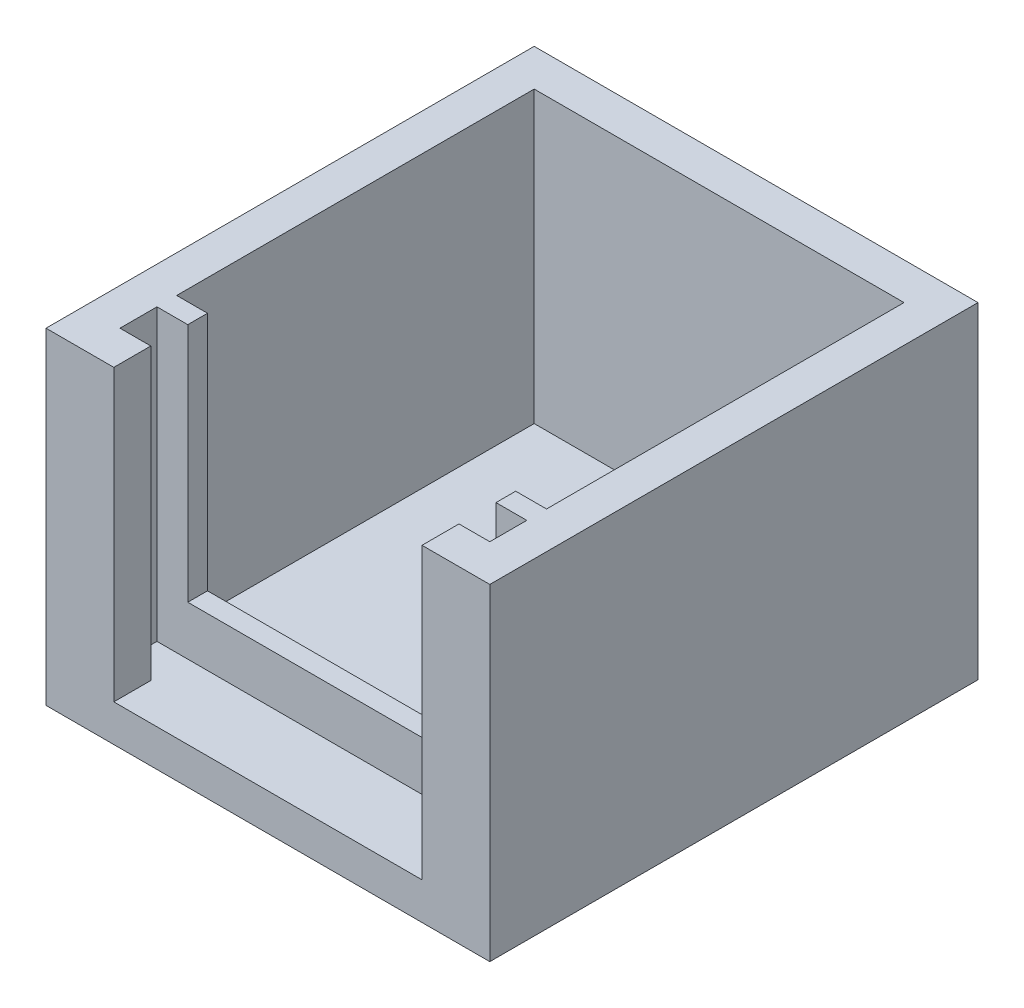
ISO-10303-21;
HEADER;
FILE_DESCRIPTION(('STEP AP214'),'2;1');
FILE_NAME('part.step','',(''),(''),'','','');
FILE_SCHEMA(('AUTOMOTIVE_DESIGN { 1 0 10303 214 1 1 1 1 }'));
ENDSEC;
DATA;
#1=APPLICATION_CONTEXT('core data for automotive mechanical design processes');
#2=APPLICATION_PROTOCOL_DEFINITION('international standard','automotive_design',2000,#1);
#3=PRODUCT_CONTEXT('',#1,'mechanical');
#4=PRODUCT('Part','Part','',(#3));
#5=PRODUCT_RELATED_PRODUCT_CATEGORY('part','',(#4));
#6=PRODUCT_DEFINITION_FORMATION('','',#4);
#7=PRODUCT_DEFINITION_CONTEXT('part definition',#1,'design');
#8=PRODUCT_DEFINITION('design','',#6,#7);
#9=PRODUCT_DEFINITION_SHAPE('','',#8);
#10=(LENGTH_UNIT() NAMED_UNIT(*) SI_UNIT(.MILLI.,.METRE.));
#11=(NAMED_UNIT(*) PLANE_ANGLE_UNIT() SI_UNIT($,.RADIAN.));
#12=(NAMED_UNIT(*) SI_UNIT($,.STERADIAN.) SOLID_ANGLE_UNIT());
#13=UNCERTAINTY_MEASURE_WITH_UNIT(LENGTH_MEASURE(1.E-05),#10,'distance_accuracy_value','');
#14=(GEOMETRIC_REPRESENTATION_CONTEXT(3) GLOBAL_UNCERTAINTY_ASSIGNED_CONTEXT((#13)) GLOBAL_UNIT_ASSIGNED_CONTEXT((#10,
#11,#12)) REPRESENTATION_CONTEXT('',''));
#15=CARTESIAN_POINT('',(0.,0.,0.));
#16=DIRECTION('',(0.,0.,1.));
#17=DIRECTION('',(1.,0.,0.));
#18=AXIS2_PLACEMENT_3D('',#15,#16,#17);
#19=CARTESIAN_POINT('',(0.,23.5,14.456705616122));
#20=DIRECTION('',(0.,0.,1.));
#21=DIRECTION('',(1.,0.,0.));
#22=AXIS2_PLACEMENT_3D('',#19,#20,#21);
#23=PLANE('',#22);
#24=DIRECTION('',(-1.,0.,0.));
#25=VECTOR('',#24,1.);
#26=CARTESIAN_POINT('',(0.,23.5,14.456705616122));
#27=LINE('',#26,#25);
#28=CARTESIAN_POINT('',(-18.611740355916,23.5,14.456705616122));
#29=VERTEX_POINT('',#28);
#30=CARTESIAN_POINT('',(-21.111740355916,23.5,14.456705616122));
#31=VERTEX_POINT('',#30);
#32=EDGE_CURVE('E274',#29,#31,#27,.T.);
#33=ORIENTED_EDGE('',*,*,#32,.T.);
#34=DIRECTION('',(0.,-1.,0.));
#35=VECTOR('',#34,1.);
#36=CARTESIAN_POINT('',(-21.111740355916,0.,14.456705616122));
#37=LINE('',#36,#35);
#38=CARTESIAN_POINT('',(-21.111740355916,4.,14.456705616122));
#39=VERTEX_POINT('',#38);
#40=EDGE_CURVE('E346',#31,#39,#37,.T.);
#41=ORIENTED_EDGE('',*,*,#40,.T.);
#42=DIRECTION('',(1.,0.,0.));
#43=VECTOR('',#42,1.);
#44=CARTESIAN_POINT('',(0.,4.,14.456705616122));
#45=LINE('',#44,#43);
#46=CARTESIAN_POINT('',(-46.111740355916,4.,14.456705616122));
#47=VERTEX_POINT('',#46);
#48=EDGE_CURVE('E359',#47,#39,#45,.T.);
#49=ORIENTED_EDGE('',*,*,#48,.F.);
#50=DIRECTION('',(0.,-1.,0.));
#51=VECTOR('',#50,1.);
#52=CARTESIAN_POINT('',(-46.111740355916,0.,14.456705616122));
#53=LINE('',#52,#51);
#54=CARTESIAN_POINT('',(-46.111740355916,23.5,14.456705616122));
#55=VERTEX_POINT('',#54);
#56=EDGE_CURVE('E355',#55,#47,#53,.T.);
#57=ORIENTED_EDGE('',*,*,#56,.F.);
#58=CARTESIAN_POINT('',(-48.611740355916,23.5,14.456705616122));
#59=VERTEX_POINT('',#58);
#60=EDGE_CURVE('E278',#55,#59,#27,.T.);
#61=ORIENTED_EDGE('',*,*,#60,.T.);
#62=DIRECTION('',(0.,-1.,0.));
#63=VECTOR('',#62,1.);
#64=CARTESIAN_POINT('',(-48.611740355916,23.5,14.456705616122));
#65=LINE('',#64,#63);
#66=CARTESIAN_POINT('',(-48.611740355916,0.,14.456705616122));
#67=VERTEX_POINT('',#66);
#68=EDGE_CURVE('E186',#59,#67,#65,.T.);
#69=ORIENTED_EDGE('',*,*,#68,.T.);
#70=DIRECTION('',(-1.,0.,0.));
#71=VECTOR('',#70,1.);
#72=CARTESIAN_POINT('',(0.,0.,14.456705616122));
#73=LINE('',#72,#71);
#74=CARTESIAN_POINT('',(-18.611740355916,0.,14.456705616122));
#75=VERTEX_POINT('',#74);
#76=EDGE_CURVE('E242',#75,#67,#73,.T.);
#77=ORIENTED_EDGE('',*,*,#76,.F.);
#78=DIRECTION('',(0.,-1.,0.));
#79=VECTOR('',#78,1.);
#80=CARTESIAN_POINT('',(-18.611740355916,23.5,14.456705616122));
#81=LINE('',#80,#79);
#82=EDGE_CURVE('E178',#29,#75,#81,.T.);
#83=ORIENTED_EDGE('',*,*,#82,.F.);
#84=EDGE_LOOP('',(#33,#41,#49,#57,#61,#69,#77,#83));
#85=FACE_BOUND('',#84,.T.);
#86=ADVANCED_FACE('F41',(#85),#23,.T.);
#87=CARTESIAN_POINT('',(0.,23.5,12.856705616122));
#88=DIRECTION('',(0.,0.,-1.));
#89=DIRECTION('',(-1.,0.,0.));
#90=AXIS2_PLACEMENT_3D('',#87,#88,#89);
#91=PLANE('',#90);
#92=DIRECTION('',(1.,0.,0.));
#93=VECTOR('',#92,1.);
#94=CARTESIAN_POINT('',(0.,4.,12.856705616122));
#95=LINE('',#94,#93);
#96=CARTESIAN_POINT('',(-46.111740355916,4.,12.856705616122));
#97=VERTEX_POINT('',#96);
#98=CARTESIAN_POINT('',(-21.111740355916,4.,12.856705616122));
#99=VERTEX_POINT('',#98);
#100=EDGE_CURVE('E342',#97,#99,#95,.T.);
#101=ORIENTED_EDGE('',*,*,#100,.T.);
#102=DIRECTION('',(0.,-1.,0.));
#103=VECTOR('',#102,1.);
#104=CARTESIAN_POINT('',(-21.111740355916,0.,12.856705616122));
#105=LINE('',#104,#103);
#106=CARTESIAN_POINT('',(-21.111740355916,23.5,12.856705616122));
#107=VERTEX_POINT('',#106);
#108=EDGE_CURVE('E319',#107,#99,#105,.T.);
#109=ORIENTED_EDGE('',*,*,#108,.F.);
#110=DIRECTION('',(1.,0.,0.));
#111=VECTOR('',#110,1.);
#112=CARTESIAN_POINT('',(0.,23.5,12.856705616122));
#113=LINE('',#112,#111);
#114=CARTESIAN_POINT('',(-18.611740355916,23.5,12.856705616122));
#115=VERTEX_POINT('',#114);
#116=EDGE_CURVE('E305',#107,#115,#113,.T.);
#117=ORIENTED_EDGE('',*,*,#116,.T.);
#118=DIRECTION('',(0.,-1.,0.));
#119=VECTOR('',#118,1.);
#120=CARTESIAN_POINT('',(-18.611740355916,23.5,12.856705616122));
#121=LINE('',#120,#119);
#122=CARTESIAN_POINT('',(-18.611740355916,0.,12.856705616122));
#123=VERTEX_POINT('',#122);
#124=EDGE_CURVE('E210',#115,#123,#121,.T.);
#125=ORIENTED_EDGE('',*,*,#124,.T.);
#126=DIRECTION('',(1.,0.,0.));
#127=VECTOR('',#126,1.);
#128=CARTESIAN_POINT('',(0.,0.,12.856705616122));
#129=LINE('',#128,#127);
#130=CARTESIAN_POINT('',(-48.611740355916,0.,12.856705616122));
#131=VERTEX_POINT('',#130);
#132=EDGE_CURVE('E255',#131,#123,#129,.T.);
#133=ORIENTED_EDGE('',*,*,#132,.F.);
#134=DIRECTION('',(0.,-1.,0.));
#135=VECTOR('',#134,1.);
#136=CARTESIAN_POINT('',(-48.611740355916,23.5,12.856705616122));
#137=LINE('',#136,#135);
#138=CARTESIAN_POINT('',(-48.611740355916,23.5,12.856705616122));
#139=VERTEX_POINT('',#138);
#140=EDGE_CURVE('E206',#139,#131,#137,.T.);
#141=ORIENTED_EDGE('',*,*,#140,.F.);
#142=CARTESIAN_POINT('',(-46.111740355916,23.5,12.856705616122));
#143=VERTEX_POINT('',#142);
#144=EDGE_CURVE('E301',#139,#143,#113,.T.);
#145=ORIENTED_EDGE('',*,*,#144,.T.);
#146=DIRECTION('',(0.,-1.,0.));
#147=VECTOR('',#146,1.);
#148=CARTESIAN_POINT('',(-46.111740355916,0.,12.856705616122));
#149=LINE('',#148,#147);
#150=EDGE_CURVE('E59',#143,#97,#149,.T.);
#151=ORIENTED_EDGE('',*,*,#150,.T.);
#152=EDGE_LOOP('',(#101,#109,#117,#125,#133,#141,#145,#151));
#153=FACE_BOUND('',#152,.T.);
#154=ADVANCED_FACE('F372',(#153),#91,.T.);
#155=CARTESIAN_POINT('',(0.,23.5,0.));
#156=DIRECTION('',(0.,1.,0.));
#157=DIRECTION('',(0.,0.,1.));
#158=AXIS2_PLACEMENT_3D('',#155,#156,#157);
#159=PLANE('',#158);
#160=ORIENTED_EDGE('',*,*,#116,.F.);
#161=DIRECTION('',(0.,0.,1.));
#162=VECTOR('',#161,1.);
#163=CARTESIAN_POINT('',(-21.111740355916,23.5,-19.144294383878));
#164=LINE('',#163,#162);
#165=EDGE_CURVE('E341',#107,#31,#164,.T.);
#166=ORIENTED_EDGE('',*,*,#165,.T.);
#167=ORIENTED_EDGE('',*,*,#32,.F.);
#168=DIRECTION('',(0.,0.,1.));
#169=VECTOR('',#168,1.);
#170=CARTESIAN_POINT('',(-18.611740355916,23.5,0.));
#171=LINE('',#170,#169);
#172=CARTESIAN_POINT('',(-18.611740355916,23.5,17.456705616122));
#173=VERTEX_POINT('',#172);
#174=EDGE_CURVE('E164',#29,#173,#171,.T.);
#175=ORIENTED_EDGE('',*,*,#174,.T.);
#176=DIRECTION('',(-1.,0.,0.));
#177=VECTOR('',#176,1.);
#178=CARTESIAN_POINT('',(0.,23.5,17.456705616122));
#179=LINE('',#178,#177);
#180=CARTESIAN_POINT('',(-21.111740355916,23.5,17.456705616122));
#181=VERTEX_POINT('',#180);
#182=EDGE_CURVE('E157',#173,#181,#179,.T.);
#183=ORIENTED_EDGE('',*,*,#182,.T.);
#184=DIRECTION('',(0.,0.,1.));
#185=VECTOR('',#184,1.);
#186=CARTESIAN_POINT('',(-21.111740355916,23.5,0.));
#187=LINE('',#186,#185);
#188=CARTESIAN_POINT('',(-21.111740355916,23.5,20.456705616122));
#189=VERTEX_POINT('',#188);
#190=EDGE_CURVE('E150',#181,#189,#187,.T.);
#191=ORIENTED_EDGE('',*,*,#190,.T.);
#192=DIRECTION('',(1.,0.,0.));
#193=VECTOR('',#192,1.);
#194=CARTESIAN_POINT('',(0.,23.5,20.456705616122));
#195=LINE('',#194,#193);
#196=CARTESIAN_POINT('',(-15.611740355916,23.5,20.456705616122));
#197=VERTEX_POINT('',#196);
#198=EDGE_CURVE('E68',#189,#197,#195,.T.);
#199=ORIENTED_EDGE('',*,*,#198,.T.);
#200=DIRECTION('',(0.,0.,1.));
#201=VECTOR('',#200,1.);
#202=CARTESIAN_POINT('',(-15.611740355916,23.5,0.));
#203=LINE('',#202,#201);
#204=CARTESIAN_POINT('',(-15.611740355916,23.5,-19.143294383878));
#205=VERTEX_POINT('',#204);
#206=EDGE_CURVE('E298',#205,#197,#203,.T.);
#207=ORIENTED_EDGE('',*,*,#206,.F.);
#208=DIRECTION('',(1.,0.,0.));
#209=VECTOR('',#208,1.);
#210=CARTESIAN_POINT('',(0.,23.5,-19.143294383878));
#211=LINE('',#210,#209);
#212=CARTESIAN_POINT('',(-51.611740355916,23.5,-19.143294383878));
#213=VERTEX_POINT('',#212);
#214=EDGE_CURVE('E294',#213,#205,#211,.T.);
#215=ORIENTED_EDGE('',*,*,#214,.F.);
#216=DIRECTION('',(0.,0.,1.));
#217=VECTOR('',#216,1.);
#218=CARTESIAN_POINT('',(-51.611740355916,23.5,0.));
#219=LINE('',#218,#217);
#220=CARTESIAN_POINT('',(-51.611740355916,23.5,20.456705616122));
#221=VERTEX_POINT('',#220);
#222=EDGE_CURVE('E290',#213,#221,#219,.T.);
#223=ORIENTED_EDGE('',*,*,#222,.T.);
#224=DIRECTION('',(1.,0.,0.));
#225=VECTOR('',#224,1.);
#226=CARTESIAN_POINT('',(0.,23.5,20.456705616122));
#227=LINE('',#226,#225);
#228=CARTESIAN_POINT('',(-46.111740355916,23.5,20.456705616122));
#229=VERTEX_POINT('',#228);
#230=EDGE_CURVE('E287',#221,#229,#227,.T.);
#231=ORIENTED_EDGE('',*,*,#230,.T.);
#232=DIRECTION('',(0.,0.,1.));
#233=VECTOR('',#232,1.);
#234=CARTESIAN_POINT('',(-46.111740355916,23.5,0.));
#235=LINE('',#234,#233);
#236=CARTESIAN_POINT('',(-46.111740355916,23.5,17.456705616122));
#237=VERTEX_POINT('',#236);
#238=EDGE_CURVE('E283',#237,#229,#235,.T.);
#239=ORIENTED_EDGE('',*,*,#238,.F.);
#240=DIRECTION('',(-1.,0.,0.));
#241=VECTOR('',#240,1.);
#242=CARTESIAN_POINT('',(0.,23.5,17.456705616122));
#243=LINE('',#242,#241);
#244=CARTESIAN_POINT('',(-48.611740355916,23.5,17.456705616122));
#245=VERTEX_POINT('',#244);
#246=EDGE_CURVE('E279',#237,#245,#243,.T.);
#247=ORIENTED_EDGE('',*,*,#246,.T.);
#248=DIRECTION('',(0.,0.,1.));
#249=VECTOR('',#248,1.);
#250=CARTESIAN_POINT('',(-48.611740355916,23.5,0.));
#251=LINE('',#250,#249);
#252=EDGE_CURVE('E282',#59,#245,#251,.T.);
#253=ORIENTED_EDGE('',*,*,#252,.F.);
#254=ORIENTED_EDGE('',*,*,#60,.F.);
#255=DIRECTION('',(0.,0.,1.));
#256=VECTOR('',#255,1.);
#257=CARTESIAN_POINT('',(-46.111740355916,23.5,-19.144294383878));
#258=LINE('',#257,#256);
#259=EDGE_CURVE('E347',#143,#55,#258,.T.);
#260=ORIENTED_EDGE('',*,*,#259,.F.);
#261=ORIENTED_EDGE('',*,*,#144,.F.);
#262=CARTESIAN_POINT('',(-48.611740355916,23.5,-16.143294383878));
#263=VERTEX_POINT('',#262);
#264=EDGE_CURVE('E235',#263,#139,#251,.T.);
#265=ORIENTED_EDGE('',*,*,#264,.F.);
#266=DIRECTION('',(1.,0.,0.));
#267=VECTOR('',#266,1.);
#268=CARTESIAN_POINT('',(0.,23.5,-16.143294383878));
#269=LINE('',#268,#267);
#270=CARTESIAN_POINT('',(-18.611740355916,23.5,-16.143294383878));
#271=VERTEX_POINT('',#270);
#272=EDGE_CURVE('E310',#263,#271,#269,.T.);
#273=ORIENTED_EDGE('',*,*,#272,.T.);
#274=DIRECTION('',(0.,0.,1.));
#275=VECTOR('',#274,1.);
#276=CARTESIAN_POINT('',(-18.611740355916,23.5,0.));
#277=LINE('',#276,#275);
#278=EDGE_CURVE('E306',#271,#115,#277,.T.);
#279=ORIENTED_EDGE('',*,*,#278,.T.);
#280=EDGE_LOOP('',(#160,#166,#167,#175,#183,#191,#199,#207,#215,#223,#231,#239,#247,#253,#254,
#260,#261,#265,#273,#279));
#281=FACE_BOUND('',#280,.T.);
#282=ADVANCED_FACE('F161',(#281),#159,.T.);
#283=CARTESIAN_POINT('',(-15.611740355916,23.5,0.));
#284=DIRECTION('',(1.,0.,0.));
#285=DIRECTION('',(0.,0.,-1.));
#286=AXIS2_PLACEMENT_3D('',#283,#284,#285);
#287=PLANE('',#286);
#288=DIRECTION('',(0.,-1.,0.));
#289=VECTOR('',#288,1.);
#290=CARTESIAN_POINT('',(-15.611740355916,23.5,20.456705616122));
#291=LINE('',#290,#289);
#292=CARTESIAN_POINT('',(-15.611740355916,-3.,20.456705616122));
#293=VERTEX_POINT('',#292);
#294=EDGE_CURVE('E180',#197,#293,#291,.T.);
#295=ORIENTED_EDGE('',*,*,#294,.T.);
#296=DIRECTION('',(0.,0.,1.));
#297=VECTOR('',#296,1.);
#298=CARTESIAN_POINT('',(-15.611740355916,-3.,20.456705616122));
#299=LINE('',#298,#297);
#300=CARTESIAN_POINT('',(-15.611740355916,-3.,-19.143294383878));
#301=VERTEX_POINT('',#300);
#302=EDGE_CURVE('E323',#301,#293,#299,.T.);
#303=ORIENTED_EDGE('',*,*,#302,.F.);
#304=DIRECTION('',(0.,-1.,0.));
#305=VECTOR('',#304,1.);
#306=CARTESIAN_POINT('',(-15.611740355916,23.5,-19.143294383878));
#307=LINE('',#306,#305);
#308=EDGE_CURVE('E11',#205,#301,#307,.T.);
#309=ORIENTED_EDGE('',*,*,#308,.F.);
#310=ORIENTED_EDGE('',*,*,#206,.T.);
#311=EDGE_LOOP('',(#295,#303,#309,#310));
#312=FACE_BOUND('',#311,.T.);
#313=ADVANCED_FACE('F468',(#312),#287,.T.);
#314=CARTESIAN_POINT('',(0.,23.5,-19.143294383878));
#315=DIRECTION('',(0.,0.,-1.));
#316=DIRECTION('',(-1.,0.,0.));
#317=AXIS2_PLACEMENT_3D('',#314,#315,#316);
#318=PLANE('',#317);
#319=ORIENTED_EDGE('',*,*,#308,.T.);
#320=DIRECTION('',(1.,0.,0.));
#321=VECTOR('',#320,1.);
#322=CARTESIAN_POINT('',(-51.611740355916,-3.,-19.143294383878));
#323=LINE('',#322,#321);
#324=CARTESIAN_POINT('',(-51.611740355916,-3.,-19.143294383878));
#325=VERTEX_POINT('',#324);
#326=EDGE_CURVE('E326',#325,#301,#323,.T.);
#327=ORIENTED_EDGE('',*,*,#326,.F.);
#328=DIRECTION('',(0.,-1.,0.));
#329=VECTOR('',#328,1.);
#330=CARTESIAN_POINT('',(-51.611740355916,23.5,-19.143294383878));
#331=LINE('',#330,#329);
#332=EDGE_CURVE('E51',#213,#325,#331,.T.);
#333=ORIENTED_EDGE('',*,*,#332,.F.);
#334=ORIENTED_EDGE('',*,*,#214,.T.);
#335=EDGE_LOOP('',(#319,#327,#333,#334));
#336=FACE_BOUND('',#335,.T.);
#337=ADVANCED_FACE('F464',(#336),#318,.T.);
#338=CARTESIAN_POINT('',(-51.611740355916,23.5,0.));
#339=DIRECTION('',(1.,0.,0.));
#340=DIRECTION('',(0.,0.,-1.));
#341=AXIS2_PLACEMENT_3D('',#338,#339,#340);
#342=PLANE('',#341);
#343=ORIENTED_EDGE('',*,*,#332,.T.);
#344=DIRECTION('',(0.,0.,-1.));
#345=VECTOR('',#344,1.);
#346=CARTESIAN_POINT('',(-51.611740355916,-3.,20.456705616122));
#347=LINE('',#346,#345);
#348=CARTESIAN_POINT('',(-51.611740355916,-3.,20.456705616122));
#349=VERTEX_POINT('',#348);
#350=EDGE_CURVE('E318',#349,#325,#347,.T.);
#351=ORIENTED_EDGE('',*,*,#350,.F.);
#352=DIRECTION('',(0.,-1.,0.));
#353=VECTOR('',#352,1.);
#354=CARTESIAN_POINT('',(-51.611740355916,23.5,20.456705616122));
#355=LINE('',#354,#353);
#356=EDGE_CURVE('E199',#221,#349,#355,.T.);
#357=ORIENTED_EDGE('',*,*,#356,.F.);
#358=ORIENTED_EDGE('',*,*,#222,.F.);
#359=EDGE_LOOP('',(#343,#351,#357,#358));
#360=FACE_BOUND('',#359,.T.);
#361=ADVANCED_FACE('F460',(#360),#342,.F.);
#362=CARTESIAN_POINT('',(-46.111740355916,23.5,0.));
#363=DIRECTION('',(1.,0.,0.));
#364=DIRECTION('',(0.,0.,-1.));
#365=AXIS2_PLACEMENT_3D('',#362,#363,#364);
#366=PLANE('',#365);
#367=DIRECTION('',(0.,0.,1.));
#368=VECTOR('',#367,1.);
#369=CARTESIAN_POINT('',(-46.111740355916,0.,0.));
#370=LINE('',#369,#368);
#371=CARTESIAN_POINT('',(-46.111740355916,0.,17.456705616122));
#372=VERTEX_POINT('',#371);
#373=CARTESIAN_POINT('',(-46.111740355916,0.,20.456705616122));
#374=VERTEX_POINT('',#373);
#375=EDGE_CURVE('E251',#372,#374,#370,.T.);
#376=ORIENTED_EDGE('',*,*,#375,.F.);
#377=DIRECTION('',(0.,-1.,0.));
#378=VECTOR('',#377,1.);
#379=CARTESIAN_POINT('',(-46.111740355916,23.5,17.456705616122));
#380=LINE('',#379,#378);
#381=EDGE_CURVE('E192',#237,#372,#380,.T.);
#382=ORIENTED_EDGE('',*,*,#381,.F.);
#383=ORIENTED_EDGE('',*,*,#238,.T.);
#384=DIRECTION('',(0.,-1.,0.));
#385=VECTOR('',#384,1.);
#386=CARTESIAN_POINT('',(-46.111740355916,23.5,20.456705616122));
#387=LINE('',#386,#385);
#388=EDGE_CURVE('E195',#229,#374,#387,.T.);
#389=ORIENTED_EDGE('',*,*,#388,.T.);
#390=EDGE_LOOP('',(#376,#382,#383,#389));
#391=FACE_BOUND('',#390,.T.);
#392=ADVANCED_FACE('F456',(#391),#366,.T.);
#393=CARTESIAN_POINT('',(0.,23.5,17.456705616122));
#394=DIRECTION('',(0.,0.,1.));
#395=DIRECTION('',(1.,0.,0.));
#396=AXIS2_PLACEMENT_3D('',#393,#394,#395);
#397=PLANE('',#396);
#398=DIRECTION('',(-1.,0.,0.));
#399=VECTOR('',#398,1.);
#400=CARTESIAN_POINT('',(0.,0.,17.456705616122));
#401=LINE('',#400,#399);
#402=CARTESIAN_POINT('',(-48.611740355916,0.,17.456705616122));
#403=VERTEX_POINT('',#402);
#404=EDGE_CURVE('E247',#372,#403,#401,.T.);
#405=ORIENTED_EDGE('',*,*,#404,.T.);
#406=DIRECTION('',(0.,-1.,0.));
#407=VECTOR('',#406,1.);
#408=CARTESIAN_POINT('',(-48.611740355916,23.5,17.456705616122));
#409=LINE('',#408,#407);
#410=EDGE_CURVE('E189',#245,#403,#409,.T.);
#411=ORIENTED_EDGE('',*,*,#410,.F.);
#412=ORIENTED_EDGE('',*,*,#246,.F.);
#413=ORIENTED_EDGE('',*,*,#381,.T.);
#414=EDGE_LOOP('',(#405,#411,#412,#413));
#415=FACE_BOUND('',#414,.T.);
#416=ADVANCED_FACE('F453',(#415),#397,.F.);
#417=CARTESIAN_POINT('',(-48.611740355916,23.5,0.));
#418=DIRECTION('',(1.,0.,0.));
#419=DIRECTION('',(0.,0.,-1.));
#420=AXIS2_PLACEMENT_3D('',#417,#418,#419);
#421=PLANE('',#420);
#422=DIRECTION('',(0.,0.,1.));
#423=VECTOR('',#422,1.);
#424=CARTESIAN_POINT('',(-48.611740355916,0.,0.));
#425=LINE('',#424,#423);
#426=EDGE_CURVE('E246',#67,#403,#425,.T.);
#427=ORIENTED_EDGE('',*,*,#426,.F.);
#428=ORIENTED_EDGE('',*,*,#68,.F.);
#429=ORIENTED_EDGE('',*,*,#252,.T.);
#430=ORIENTED_EDGE('',*,*,#410,.T.);
#431=EDGE_LOOP('',(#427,#428,#429,#430));
#432=FACE_BOUND('',#431,.T.);
#433=ADVANCED_FACE('F424',(#432),#421,.T.);
#434=CARTESIAN_POINT('',(-18.611740355916,23.5,0.));
#435=DIRECTION('',(1.,0.,0.));
#436=DIRECTION('',(0.,0.,-1.));
#437=AXIS2_PLACEMENT_3D('',#434,#435,#436);
#438=PLANE('',#437);
#439=DIRECTION('',(0.,0.,1.));
#440=VECTOR('',#439,1.);
#441=CARTESIAN_POINT('',(-18.611740355916,0.,0.));
#442=LINE('',#441,#440);
#443=CARTESIAN_POINT('',(-18.611740355916,0.,17.456705616122));
#444=VERTEX_POINT('',#443);
#445=EDGE_CURVE('E238',#75,#444,#442,.T.);
#446=ORIENTED_EDGE('',*,*,#445,.T.);
#447=DIRECTION('',(0.,-1.,0.));
#448=VECTOR('',#447,1.);
#449=CARTESIAN_POINT('',(-18.611740355916,23.5,17.456705616122));
#450=LINE('',#449,#448);
#451=EDGE_CURVE('E174',#173,#444,#450,.T.);
#452=ORIENTED_EDGE('',*,*,#451,.F.);
#453=ORIENTED_EDGE('',*,*,#174,.F.);
#454=ORIENTED_EDGE('',*,*,#82,.T.);
#455=EDGE_LOOP('',(#446,#452,#453,#454));
#456=FACE_BOUND('',#455,.T.);
#457=ADVANCED_FACE('F432',(#456),#438,.F.);
#458=CARTESIAN_POINT('',(0.,23.5,17.456705616122));
#459=DIRECTION('',(0.,0.,1.));
#460=DIRECTION('',(1.,0.,0.));
#461=AXIS2_PLACEMENT_3D('',#458,#459,#460);
#462=PLANE('',#461);
#463=DIRECTION('',(-1.,0.,0.));
#464=VECTOR('',#463,1.);
#465=CARTESIAN_POINT('',(0.,0.,17.456705616122));
#466=LINE('',#465,#464);
#467=CARTESIAN_POINT('',(-21.111740355916,0.,17.456705616122));
#468=VERTEX_POINT('',#467);
#469=EDGE_CURVE('E171',#444,#468,#466,.T.);
#470=ORIENTED_EDGE('',*,*,#469,.T.);
#471=DIRECTION('',(0.,-1.,0.));
#472=VECTOR('',#471,1.);
#473=CARTESIAN_POINT('',(-21.111740355916,23.5,17.456705616122));
#474=LINE('',#473,#472);
#475=EDGE_CURVE('E154',#181,#468,#474,.T.);
#476=ORIENTED_EDGE('',*,*,#475,.F.);
#477=ORIENTED_EDGE('',*,*,#182,.F.);
#478=ORIENTED_EDGE('',*,*,#451,.T.);
#479=EDGE_LOOP('',(#470,#476,#477,#478));
#480=FACE_BOUND('',#479,.T.);
#481=ADVANCED_FACE('F169',(#480),#462,.F.);
#482=CARTESIAN_POINT('',(-21.111740355916,23.5,0.));
#483=DIRECTION('',(1.,0.,0.));
#484=DIRECTION('',(0.,0.,-1.));
#485=AXIS2_PLACEMENT_3D('',#482,#483,#484);
#486=PLANE('',#485);
#487=DIRECTION('',(0.,0.,1.));
#488=VECTOR('',#487,1.);
#489=CARTESIAN_POINT('',(-21.111740355916,0.,0.));
#490=LINE('',#489,#488);
#491=CARTESIAN_POINT('',(-21.111740355916,0.,20.456705616122));
#492=VERTEX_POINT('',#491);
#493=EDGE_CURVE('E232',#468,#492,#490,.T.);
#494=ORIENTED_EDGE('',*,*,#493,.T.);
#495=DIRECTION('',(0.,-1.,0.));
#496=VECTOR('',#495,1.);
#497=CARTESIAN_POINT('',(-21.111740355916,23.5,20.456705616122));
#498=LINE('',#497,#496);
#499=EDGE_CURVE('E101',#189,#492,#498,.T.);
#500=ORIENTED_EDGE('',*,*,#499,.F.);
#501=ORIENTED_EDGE('',*,*,#190,.F.);
#502=ORIENTED_EDGE('',*,*,#475,.T.);
#503=EDGE_LOOP('',(#494,#500,#501,#502));
#504=FACE_BOUND('',#503,.T.);
#505=ADVANCED_FACE('F152',(#504),#486,.F.);
#506=CARTESIAN_POINT('',(-48.611740355916,0.,-16.143294383878));
#507=VERTEX_POINT('',#506);
#508=EDGE_CURVE('E265',#507,#131,#425,.T.);
#509=ORIENTED_EDGE('',*,*,#508,.F.);
#510=DIRECTION('',(0.,-1.,0.));
#511=VECTOR('',#510,1.);
#512=CARTESIAN_POINT('',(-48.611740355916,23.5,-16.143294383878));
#513=LINE('',#512,#511);
#514=EDGE_CURVE('E45',#263,#507,#513,.T.);
#515=ORIENTED_EDGE('',*,*,#514,.F.);
#516=ORIENTED_EDGE('',*,*,#264,.T.);
#517=ORIENTED_EDGE('',*,*,#140,.T.);
#518=EDGE_LOOP('',(#509,#515,#516,#517));
#519=FACE_BOUND('',#518,.T.);
#520=ADVANCED_FACE('F412',(#519),#421,.T.);
#521=CARTESIAN_POINT('',(0.,23.5,-16.143294383878));
#522=DIRECTION('',(0.,0.,-1.));
#523=DIRECTION('',(-1.,0.,0.));
#524=AXIS2_PLACEMENT_3D('',#521,#522,#523);
#525=PLANE('',#524);
#526=DIRECTION('',(1.,0.,0.));
#527=VECTOR('',#526,1.);
#528=CARTESIAN_POINT('',(0.,0.,-16.143294383878));
#529=LINE('',#528,#527);
#530=CARTESIAN_POINT('',(-18.611740355916,0.,-16.143294383878));
#531=VERTEX_POINT('',#530);
#532=EDGE_CURVE('E262',#507,#531,#529,.T.);
#533=ORIENTED_EDGE('',*,*,#532,.T.);
#534=DIRECTION('',(0.,-1.,0.));
#535=VECTOR('',#534,1.);
#536=CARTESIAN_POINT('',(-18.611740355916,23.5,-16.143294383878));
#537=LINE('',#536,#535);
#538=EDGE_CURVE('E213',#271,#531,#537,.T.);
#539=ORIENTED_EDGE('',*,*,#538,.F.);
#540=ORIENTED_EDGE('',*,*,#272,.F.);
#541=ORIENTED_EDGE('',*,*,#514,.T.);
#542=EDGE_LOOP('',(#533,#539,#540,#541));
#543=FACE_BOUND('',#542,.T.);
#544=ADVANCED_FACE('F43',(#543),#525,.F.);
#545=CARTESIAN_POINT('',(-18.611740355916,23.5,0.));
#546=DIRECTION('',(1.,0.,0.));
#547=DIRECTION('',(0.,0.,-1.));
#548=AXIS2_PLACEMENT_3D('',#545,#546,#547);
#549=PLANE('',#548);
#550=DIRECTION('',(0.,0.,1.));
#551=VECTOR('',#550,1.);
#552=CARTESIAN_POINT('',(-18.611740355916,0.,0.));
#553=LINE('',#552,#551);
#554=EDGE_CURVE('E259',#531,#123,#553,.T.);
#555=ORIENTED_EDGE('',*,*,#554,.T.);
#556=ORIENTED_EDGE('',*,*,#124,.F.);
#557=ORIENTED_EDGE('',*,*,#278,.F.);
#558=ORIENTED_EDGE('',*,*,#538,.T.);
#559=EDGE_LOOP('',(#555,#556,#557,#558));
#560=FACE_BOUND('',#559,.T.);
#561=ADVANCED_FACE('F416',(#560),#549,.F.);
#562=CARTESIAN_POINT('',(0.,23.5,20.456705616122));
#563=DIRECTION('',(0.,0.,-1.));
#564=DIRECTION('',(-1.,0.,0.));
#565=AXIS2_PLACEMENT_3D('',#562,#563,#564);
#566=PLANE('',#565);
#567=ORIENTED_EDGE('',*,*,#499,.T.);
#568=DIRECTION('',(-1.,0.,0.));
#569=VECTOR('',#568,1.);
#570=CARTESIAN_POINT('',(-51.611740355916,0.,20.456705616122));
#571=LINE('',#570,#569);
#572=EDGE_CURVE('E315',#492,#374,#571,.T.);
#573=ORIENTED_EDGE('',*,*,#572,.T.);
#574=ORIENTED_EDGE('',*,*,#388,.F.);
#575=ORIENTED_EDGE('',*,*,#230,.F.);
#576=ORIENTED_EDGE('',*,*,#356,.T.);
#577=DIRECTION('',(-1.,0.,0.));
#578=VECTOR('',#577,1.);
#579=CARTESIAN_POINT('',(-51.611740355916,-3.,20.456705616122));
#580=LINE('',#579,#578);
#581=EDGE_CURVE('E269',#293,#349,#580,.T.);
#582=ORIENTED_EDGE('',*,*,#581,.F.);
#583=ORIENTED_EDGE('',*,*,#294,.F.);
#584=ORIENTED_EDGE('',*,*,#198,.F.);
#585=EDGE_LOOP('',(#567,#573,#574,#575,#576,#582,#583,#584));
#586=FACE_BOUND('',#585,.T.);
#587=ADVANCED_FACE('F472',(#586),#566,.F.);
#588=CARTESIAN_POINT('',(0.,0.,0.));
#589=DIRECTION('',(0.,-1.,0.));
#590=DIRECTION('',(0.,0.,-1.));
#591=AXIS2_PLACEMENT_3D('',#588,#589,#590);
#592=PLANE('',#591);
#593=ORIENTED_EDGE('',*,*,#493,.F.);
#594=ORIENTED_EDGE('',*,*,#469,.F.);
#595=ORIENTED_EDGE('',*,*,#445,.F.);
#596=ORIENTED_EDGE('',*,*,#76,.T.);
#597=ORIENTED_EDGE('',*,*,#426,.T.);
#598=ORIENTED_EDGE('',*,*,#404,.F.);
#599=ORIENTED_EDGE('',*,*,#375,.T.);
#600=ORIENTED_EDGE('',*,*,#572,.F.);
#601=EDGE_LOOP('',(#593,#594,#595,#596,#597,#598,#599,#600));
#602=FACE_BOUND('',#601,.T.);
#603=ADVANCED_FACE('F430',(#602),#592,.F.);
#604=CARTESIAN_POINT('',(0.,-3.,0.));
#605=DIRECTION('',(0.,-1.,0.));
#606=DIRECTION('',(0.,0.,-1.));
#607=AXIS2_PLACEMENT_3D('',#604,#605,#606);
#608=PLANE('',#607);
#609=ORIENTED_EDGE('',*,*,#350,.T.);
#610=ORIENTED_EDGE('',*,*,#326,.T.);
#611=ORIENTED_EDGE('',*,*,#302,.T.);
#612=ORIENTED_EDGE('',*,*,#581,.T.);
#613=EDGE_LOOP('',(#609,#610,#611,#612));
#614=FACE_BOUND('',#613,.T.);
#615=ADVANCED_FACE('F493',(#614),#608,.T.);
#616=ORIENTED_EDGE('',*,*,#532,.F.);
#617=ORIENTED_EDGE('',*,*,#508,.T.);
#618=ORIENTED_EDGE('',*,*,#132,.T.);
#619=ORIENTED_EDGE('',*,*,#554,.F.);
#620=EDGE_LOOP('',(#616,#617,#618,#619));
#621=FACE_BOUND('',#620,.T.);
#622=ADVANCED_FACE('F411',(#621),#592,.F.);
#623=CARTESIAN_POINT('',(0.,4.,-19.144294383878));
#624=DIRECTION('',(0.,-1.,0.));
#625=DIRECTION('',(0.,0.,-1.));
#626=AXIS2_PLACEMENT_3D('',#623,#624,#625);
#627=PLANE('',#626);
#628=DIRECTION('',(0.,0.,1.));
#629=VECTOR('',#628,1.);
#630=CARTESIAN_POINT('',(-46.111740355916,4.,-19.144294383878));
#631=LINE('',#630,#629);
#632=EDGE_CURVE('E333',#97,#47,#631,.T.);
#633=ORIENTED_EDGE('',*,*,#632,.T.);
#634=ORIENTED_EDGE('',*,*,#48,.T.);
#635=DIRECTION('',(0.,0.,1.));
#636=VECTOR('',#635,1.);
#637=CARTESIAN_POINT('',(-21.111740355916,4.,-19.144294383878));
#638=LINE('',#637,#636);
#639=EDGE_CURVE('E337',#99,#39,#638,.T.);
#640=ORIENTED_EDGE('',*,*,#639,.F.);
#641=ORIENTED_EDGE('',*,*,#100,.F.);
#642=EDGE_LOOP('',(#633,#634,#640,#641));
#643=FACE_BOUND('',#642,.T.);
#644=ADVANCED_FACE('F378',(#643),#627,.F.);
#645=CARTESIAN_POINT('',(-21.111740355916,0.,-19.144294383878));
#646=DIRECTION('',(-1.,0.,0.));
#647=DIRECTION('',(0.,0.,1.));
#648=AXIS2_PLACEMENT_3D('',#645,#646,#647);
#649=PLANE('',#648);
#650=ORIENTED_EDGE('',*,*,#108,.T.);
#651=ORIENTED_EDGE('',*,*,#639,.T.);
#652=ORIENTED_EDGE('',*,*,#40,.F.);
#653=ORIENTED_EDGE('',*,*,#165,.F.);
#654=EDGE_LOOP('',(#650,#651,#652,#653));
#655=FACE_BOUND('',#654,.T.);
#656=ADVANCED_FACE('F433',(#655),#649,.T.);
#657=CARTESIAN_POINT('',(-46.111740355916,0.,-19.144294383878));
#658=DIRECTION('',(-1.,0.,0.));
#659=DIRECTION('',(0.,0.,1.));
#660=AXIS2_PLACEMENT_3D('',#657,#658,#659);
#661=PLANE('',#660);
#662=ORIENTED_EDGE('',*,*,#259,.T.);
#663=ORIENTED_EDGE('',*,*,#56,.T.);
#664=ORIENTED_EDGE('',*,*,#632,.F.);
#665=ORIENTED_EDGE('',*,*,#150,.F.);
#666=EDGE_LOOP('',(#662,#663,#664,#665));
#667=FACE_BOUND('',#666,.T.);
#668=ADVANCED_FACE('F382',(#667),#661,.F.);
#669=CLOSED_SHELL('',(#86,#154,#282,#313,#337,#361,#392,#416,#433,#457,#481,#505,#520,#544,#561,
#587,#603,#615,#622,#644,#656,#668));
#670=MANIFOLD_SOLID_BREP('B2',#669);
#671=ADVANCED_BREP_SHAPE_REPRESENTATION('',(#18,#670),#14);
#672=SHAPE_DEFINITION_REPRESENTATION(#9,#671);
ENDSEC;
END-ISO-10303-21;
